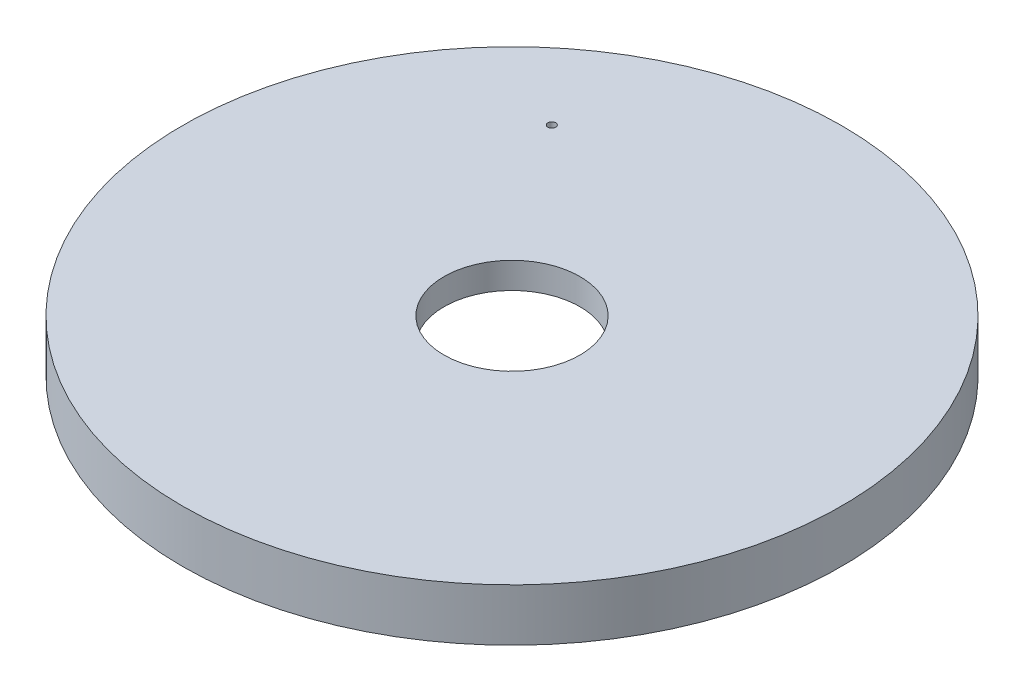
ISO-10303-21;
HEADER;
FILE_DESCRIPTION(('STEP AP214'),'2;1');
FILE_NAME('part.step','',(''),(''),'','','');
FILE_SCHEMA(('AUTOMOTIVE_DESIGN { 1 0 10303 214 1 1 1 1 }'));
ENDSEC;
DATA;
#1=APPLICATION_CONTEXT('core data for automotive mechanical design processes');
#2=APPLICATION_PROTOCOL_DEFINITION('international standard','automotive_design',2000,#1);
#3=PRODUCT_CONTEXT('',#1,'mechanical');
#4=PRODUCT('Part','Part','',(#3));
#5=PRODUCT_RELATED_PRODUCT_CATEGORY('part','',(#4));
#6=PRODUCT_DEFINITION_FORMATION('','',#4);
#7=PRODUCT_DEFINITION_CONTEXT('part definition',#1,'design');
#8=PRODUCT_DEFINITION('design','',#6,#7);
#9=PRODUCT_DEFINITION_SHAPE('','',#8);
#10=(LENGTH_UNIT() NAMED_UNIT(*) SI_UNIT(.MILLI.,.METRE.));
#11=(NAMED_UNIT(*) PLANE_ANGLE_UNIT() SI_UNIT($,.RADIAN.));
#12=(NAMED_UNIT(*) SI_UNIT($,.STERADIAN.) SOLID_ANGLE_UNIT());
#13=UNCERTAINTY_MEASURE_WITH_UNIT(LENGTH_MEASURE(1.E-05),#10,'distance_accuracy_value','');
#14=(GEOMETRIC_REPRESENTATION_CONTEXT(3) GLOBAL_UNCERTAINTY_ASSIGNED_CONTEXT((#13)) GLOBAL_UNIT_ASSIGNED_CONTEXT((#10,
#11,#12)) REPRESENTATION_CONTEXT('',''));
#15=CARTESIAN_POINT('',(0.,0.,0.));
#16=DIRECTION('',(0.,0.,1.));
#17=DIRECTION('',(1.,0.,0.));
#18=AXIS2_PLACEMENT_3D('',#15,#16,#17);
#19=CARTESIAN_POINT('',(0.,24.6083363009322,0.));
#20=DIRECTION('',(0.,1.,0.));
#21=DIRECTION('',(0.,0.,1.));
#22=AXIS2_PLACEMENT_3D('',#19,#20,#21);
#23=CYLINDRICAL_SURFACE('',#22,13.);
#24=CARTESIAN_POINT('',(0.,-2.5,0.));
#25=DIRECTION('',(0.,1.,0.));
#26=DIRECTION('',(0.,0.,1.));
#27=AXIS2_PLACEMENT_3D('',#24,#25,#26);
#28=CIRCLE('',#27,13.);
#29=CARTESIAN_POINT('',(0.,-2.5,13.));
#30=VERTEX_POINT('',#29);
#31=EDGE_CURVE('E69',#30,#30,#28,.T.);
#32=ORIENTED_EDGE('',*,*,#31,.F.);
#33=EDGE_LOOP('',(#32));
#34=FACE_BOUND('',#33,.T.);
#35=CARTESIAN_POINT('',(0.,2.5,0.));
#36=DIRECTION('',(0.,1.,0.));
#37=DIRECTION('',(0.,0.,1.));
#38=AXIS2_PLACEMENT_3D('',#35,#36,#37);
#39=CIRCLE('',#38,13.);
#40=CARTESIAN_POINT('',(0.,2.5,13.));
#41=VERTEX_POINT('',#40);
#42=EDGE_CURVE('E10',#41,#41,#39,.T.);
#43=ORIENTED_EDGE('',*,*,#42,.T.);
#44=EDGE_LOOP('',(#43));
#45=FACE_BOUND('',#44,.T.);
#46=ADVANCED_FACE('F45',(#34,#45),#23,.F.);
#47=CARTESIAN_POINT('',(13.,2.5,0.));
#48=DIRECTION('',(0.,-1.,0.));
#49=DIRECTION('',(0.,0.,-1.));
#50=AXIS2_PLACEMENT_3D('',#47,#48,#49);
#51=PLANE('',#50);
#52=CARTESIAN_POINT('',(-27.7859608156295,2.5,-35.3968979086063));
#53=DIRECTION('',(0.,-1.,0.));
#54=DIRECTION('',(0.,0.,-1.));
#55=AXIS2_PLACEMENT_3D('',#52,#53,#54);
#56=CIRCLE('',#55,0.750000000000002);
#57=CARTESIAN_POINT('',(-27.7859608156295,2.5,-36.1468979086063));
#58=VERTEX_POINT('',#57);
#59=EDGE_CURVE('E73',#58,#58,#56,.T.);
#60=ORIENTED_EDGE('',*,*,#59,.T.);
#61=EDGE_LOOP('',(#60));
#62=FACE_BOUND('',#61,.T.);
#63=ORIENTED_EDGE('',*,*,#42,.F.);
#64=EDGE_LOOP('',(#63));
#65=FACE_BOUND('',#64,.T.);
#66=CARTESIAN_POINT('',(0.,2.5,0.));
#67=DIRECTION('',(0.,1.,0.));
#68=DIRECTION('',(0.,0.,1.));
#69=AXIS2_PLACEMENT_3D('',#66,#67,#68);
#70=CIRCLE('',#69,63.);
#71=CARTESIAN_POINT('',(0.,2.5,63.));
#72=VERTEX_POINT('',#71);
#73=EDGE_CURVE('E53',#72,#72,#70,.T.);
#74=ORIENTED_EDGE('',*,*,#73,.T.);
#75=EDGE_LOOP('',(#74));
#76=FACE_BOUND('',#75,.T.);
#77=ADVANCED_FACE('F99',(#62,#65,#76),#51,.F.);
#78=CARTESIAN_POINT('',(0.,24.6083363009322,0.));
#79=DIRECTION('',(0.,1.,0.));
#80=DIRECTION('',(0.,0.,1.));
#81=AXIS2_PLACEMENT_3D('',#78,#79,#80);
#82=CYLINDRICAL_SURFACE('',#81,63.);
#83=ORIENTED_EDGE('',*,*,#73,.F.);
#84=EDGE_LOOP('',(#83));
#85=FACE_BOUND('',#84,.T.);
#86=CARTESIAN_POINT('',(0.,-7.5,0.));
#87=DIRECTION('',(0.,1.,0.));
#88=DIRECTION('',(0.,0.,1.));
#89=AXIS2_PLACEMENT_3D('',#86,#87,#88);
#90=CIRCLE('',#89,63.);
#91=CARTESIAN_POINT('',(0.,-7.5,63.));
#92=VERTEX_POINT('',#91);
#93=EDGE_CURVE('E59',#92,#92,#90,.T.);
#94=ORIENTED_EDGE('',*,*,#93,.T.);
#95=EDGE_LOOP('',(#94));
#96=FACE_BOUND('',#95,.T.);
#97=ADVANCED_FACE('F104',(#85,#96),#82,.T.);
#98=CARTESIAN_POINT('',(63.,-7.5,0.));
#99=DIRECTION('',(0.,1.,0.));
#100=DIRECTION('',(0.,0.,1.));
#101=AXIS2_PLACEMENT_3D('',#98,#99,#100);
#102=PLANE('',#101);
#103=CARTESIAN_POINT('',(-27.7859608156295,-7.5,-35.3968979086063));
#104=DIRECTION('',(0.,1.,0.));
#105=DIRECTION('',(0.,0.,1.));
#106=AXIS2_PLACEMENT_3D('',#103,#104,#105);
#107=CIRCLE('',#106,0.750000000000002);
#108=CARTESIAN_POINT('',(-27.7859608156295,-7.5,-34.6468979086063));
#109=VERTEX_POINT('',#108);
#110=EDGE_CURVE('E48',#109,#109,#107,.T.);
#111=ORIENTED_EDGE('',*,*,#110,.T.);
#112=EDGE_LOOP('',(#111));
#113=FACE_BOUND('',#112,.T.);
#114=ORIENTED_EDGE('',*,*,#93,.F.);
#115=EDGE_LOOP('',(#114));
#116=FACE_BOUND('',#115,.T.);
#117=CARTESIAN_POINT('',(0.,-7.5,0.));
#118=DIRECTION('',(0.,1.,0.));
#119=DIRECTION('',(0.,0.,1.));
#120=AXIS2_PLACEMENT_3D('',#117,#118,#119);
#121=CIRCLE('',#120,31.6602540378444);
#122=CARTESIAN_POINT('',(0.,-7.5,31.6602540378444));
#123=VERTEX_POINT('',#122);
#124=EDGE_CURVE('E65',#123,#123,#121,.T.);
#125=ORIENTED_EDGE('',*,*,#124,.T.);
#126=EDGE_LOOP('',(#125));
#127=FACE_BOUND('',#126,.T.);
#128=ADVANCED_FACE('F84',(#113,#116,#127),#102,.F.);
#129=CARTESIAN_POINT('',(0.,-2.5,0.));
#130=DIRECTION('',(0.,-1.,0.));
#131=DIRECTION('',(0.,0.,-1.));
#132=AXIS2_PLACEMENT_3D('',#129,#130,#131);
#133=CONICAL_SURFACE('',#132,13.,1.30899693899575);
#134=ORIENTED_EDGE('',*,*,#124,.F.);
#135=EDGE_LOOP('',(#134));
#136=FACE_BOUND('',#135,.T.);
#137=ORIENTED_EDGE('',*,*,#31,.T.);
#138=EDGE_LOOP('',(#137));
#139=FACE_BOUND('',#138,.T.);
#140=ADVANCED_FACE('F90',(#136,#139),#133,.F.);
#141=CARTESIAN_POINT('',(-27.7859608156295,-15.,-35.3968979086063));
#142=DIRECTION('',(0.,1.,0.));
#143=DIRECTION('',(0.,0.,1.));
#144=AXIS2_PLACEMENT_3D('',#141,#142,#143);
#145=CYLINDRICAL_SURFACE('',#144,0.750000000000002);
#146=ORIENTED_EDGE('',*,*,#110,.F.);
#147=EDGE_LOOP('',(#146));
#148=FACE_BOUND('',#147,.T.);
#149=ORIENTED_EDGE('',*,*,#59,.F.);
#150=EDGE_LOOP('',(#149));
#151=FACE_BOUND('',#150,.T.);
#152=ADVANCED_FACE('F87',(#148,#151),#145,.F.);
#153=CLOSED_SHELL('',(#46,#77,#97,#128,#140,#152));
#154=MANIFOLD_SOLID_BREP('B2',#153);
#155=ADVANCED_BREP_SHAPE_REPRESENTATION('',(#18,#154),#14);
#156=SHAPE_DEFINITION_REPRESENTATION(#9,#155);
ENDSEC;
END-ISO-10303-21;
